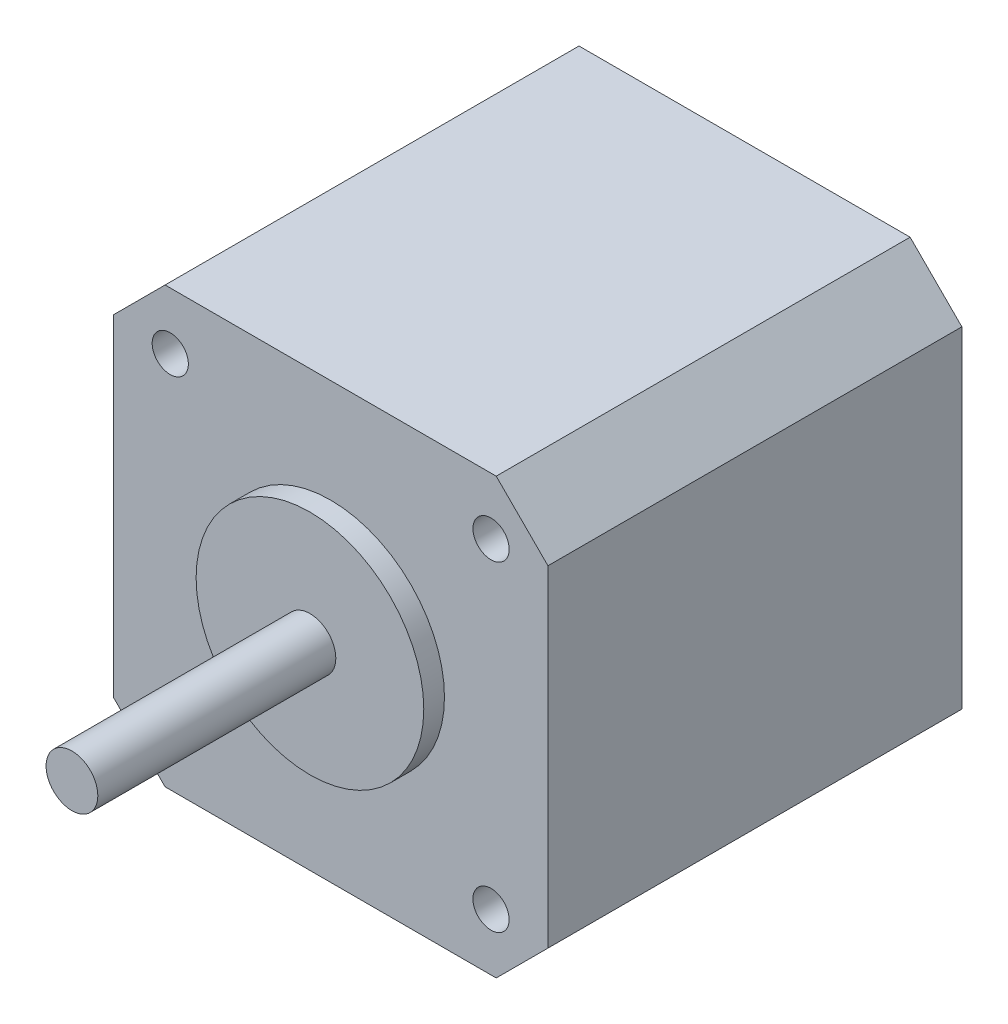
ISO-10303-21;
HEADER;
FILE_DESCRIPTION(('STEP AP214'),'2;1');
FILE_NAME('part.step','',(''),(''),'','','');
FILE_SCHEMA(('AUTOMOTIVE_DESIGN { 1 0 10303 214 1 1 1 1 }'));
ENDSEC;
DATA;
#1=APPLICATION_CONTEXT('core data for automotive mechanical design processes');
#2=APPLICATION_PROTOCOL_DEFINITION('international standard','automotive_design',2000,#1);
#3=PRODUCT_CONTEXT('',#1,'mechanical');
#4=PRODUCT('Part','Part','',(#3));
#5=PRODUCT_RELATED_PRODUCT_CATEGORY('part','',(#4));
#6=PRODUCT_DEFINITION_FORMATION('','',#4);
#7=PRODUCT_DEFINITION_CONTEXT('part definition',#1,'design');
#8=PRODUCT_DEFINITION('design','',#6,#7);
#9=PRODUCT_DEFINITION_SHAPE('','',#8);
#10=(LENGTH_UNIT() NAMED_UNIT(*) SI_UNIT(.MILLI.,.METRE.));
#11=(NAMED_UNIT(*) PLANE_ANGLE_UNIT() SI_UNIT($,.RADIAN.));
#12=(NAMED_UNIT(*) SI_UNIT($,.STERADIAN.) SOLID_ANGLE_UNIT());
#13=UNCERTAINTY_MEASURE_WITH_UNIT(LENGTH_MEASURE(1.E-05),#10,'distance_accuracy_value','');
#14=(GEOMETRIC_REPRESENTATION_CONTEXT(3) GLOBAL_UNCERTAINTY_ASSIGNED_CONTEXT((#13)) GLOBAL_UNIT_ASSIGNED_CONTEXT((#10,
#11,#12)) REPRESENTATION_CONTEXT('',''));
#15=CARTESIAN_POINT('',(0.,0.,0.));
#16=DIRECTION('',(0.,0.,1.));
#17=DIRECTION('',(1.,0.,0.));
#18=AXIS2_PLACEMENT_3D('',#15,#16,#17);
#19=CARTESIAN_POINT('',(-21.,21.,40.));
#20=DIRECTION('',(1.,0.,0.));
#21=DIRECTION('',(0.,0.,-1.));
#22=AXIS2_PLACEMENT_3D('',#19,#20,#21);
#23=PLANE('',#22);
#24=DIRECTION('',(0.,-1.,0.));
#25=VECTOR('',#24,1.);
#26=CARTESIAN_POINT('',(-21.,21.,0.));
#27=LINE('',#26,#25);
#28=CARTESIAN_POINT('',(-21.,16.,0.));
#29=VERTEX_POINT('',#28);
#30=CARTESIAN_POINT('',(-21.,-16.,0.));
#31=VERTEX_POINT('',#30);
#32=EDGE_CURVE('E127',#29,#31,#27,.T.);
#33=ORIENTED_EDGE('',*,*,#32,.T.);
#34=DIRECTION('',(0.,0.,1.));
#35=VECTOR('',#34,1.);
#36=CARTESIAN_POINT('',(-21.,-16.,40.));
#37=LINE('',#36,#35);
#38=CARTESIAN_POINT('',(-21.,-16.,40.));
#39=VERTEX_POINT('',#38);
#40=EDGE_CURVE('E105',#31,#39,#37,.T.);
#41=ORIENTED_EDGE('',*,*,#40,.T.);
#42=DIRECTION('',(0.,-1.,0.));
#43=VECTOR('',#42,1.);
#44=CARTESIAN_POINT('',(-21.,21.,40.));
#45=LINE('',#44,#43);
#46=CARTESIAN_POINT('',(-21.,16.,40.));
#47=VERTEX_POINT('',#46);
#48=EDGE_CURVE('E137',#47,#39,#45,.T.);
#49=ORIENTED_EDGE('',*,*,#48,.F.);
#50=DIRECTION('',(0.,0.,-1.));
#51=VECTOR('',#50,1.);
#52=CARTESIAN_POINT('',(-21.,16.,40.));
#53=LINE('',#52,#51);
#54=EDGE_CURVE('E110',#47,#29,#53,.T.);
#55=ORIENTED_EDGE('',*,*,#54,.T.);
#56=EDGE_LOOP('',(#33,#41,#49,#55));
#57=FACE_BOUND('',#56,.T.);
#58=ADVANCED_FACE('F34',(#57),#23,.F.);
#59=CARTESIAN_POINT('',(-21.,-21.,40.));
#60=DIRECTION('',(0.,1.,0.));
#61=DIRECTION('',(0.,0.,1.));
#62=AXIS2_PLACEMENT_3D('',#59,#60,#61);
#63=PLANE('',#62);
#64=DIRECTION('',(1.,0.,0.));
#65=VECTOR('',#64,1.);
#66=CARTESIAN_POINT('',(-21.,-21.,40.));
#67=LINE('',#66,#65);
#68=CARTESIAN_POINT('',(-16.,-21.,40.));
#69=VERTEX_POINT('',#68);
#70=CARTESIAN_POINT('',(16.,-21.,40.));
#71=VERTEX_POINT('',#70);
#72=EDGE_CURVE('E120',#69,#71,#67,.T.);
#73=ORIENTED_EDGE('',*,*,#72,.F.);
#74=DIRECTION('',(0.,0.,-1.));
#75=VECTOR('',#74,1.);
#76=CARTESIAN_POINT('',(-16.,-21.,40.));
#77=LINE('',#76,#75);
#78=CARTESIAN_POINT('',(-16.,-21.,0.));
#79=VERTEX_POINT('',#78);
#80=EDGE_CURVE('E104',#69,#79,#77,.T.);
#81=ORIENTED_EDGE('',*,*,#80,.T.);
#82=DIRECTION('',(1.,0.,0.));
#83=VECTOR('',#82,1.);
#84=CARTESIAN_POINT('',(-21.,-21.,0.));
#85=LINE('',#84,#83);
#86=CARTESIAN_POINT('',(16.,-21.,0.));
#87=VERTEX_POINT('',#86);
#88=EDGE_CURVE('E117',#79,#87,#85,.T.);
#89=ORIENTED_EDGE('',*,*,#88,.T.);
#90=DIRECTION('',(0.,0.,1.));
#91=VECTOR('',#90,1.);
#92=CARTESIAN_POINT('',(16.,-21.,40.));
#93=LINE('',#92,#91);
#94=EDGE_CURVE('E122',#87,#71,#93,.T.);
#95=ORIENTED_EDGE('',*,*,#94,.T.);
#96=EDGE_LOOP('',(#73,#81,#89,#95));
#97=FACE_BOUND('',#96,.T.);
#98=ADVANCED_FACE('F116',(#97),#63,.F.);
#99=CARTESIAN_POINT('',(21.,21.,40.));
#100=DIRECTION('',(-1.,0.,0.));
#101=DIRECTION('',(0.,0.,1.));
#102=AXIS2_PLACEMENT_3D('',#99,#100,#101);
#103=PLANE('',#102);
#104=DIRECTION('',(0.,1.,0.));
#105=VECTOR('',#104,1.);
#106=CARTESIAN_POINT('',(21.,21.,40.));
#107=LINE('',#106,#105);
#108=CARTESIAN_POINT('',(21.,-16.,40.));
#109=VERTEX_POINT('',#108);
#110=CARTESIAN_POINT('',(21.,16.,40.));
#111=VERTEX_POINT('',#110);
#112=EDGE_CURVE('E163',#109,#111,#107,.T.);
#113=ORIENTED_EDGE('',*,*,#112,.F.);
#114=DIRECTION('',(0.,0.,-1.));
#115=VECTOR('',#114,1.);
#116=CARTESIAN_POINT('',(21.,-16.,40.));
#117=LINE('',#116,#115);
#118=CARTESIAN_POINT('',(21.,-16.,0.));
#119=VERTEX_POINT('',#118);
#120=EDGE_CURVE('E156',#109,#119,#117,.T.);
#121=ORIENTED_EDGE('',*,*,#120,.T.);
#122=DIRECTION('',(0.,1.,0.));
#123=VECTOR('',#122,1.);
#124=CARTESIAN_POINT('',(21.,21.,0.));
#125=LINE('',#124,#123);
#126=CARTESIAN_POINT('',(21.,16.,0.));
#127=VERTEX_POINT('',#126);
#128=EDGE_CURVE('E126',#119,#127,#125,.T.);
#129=ORIENTED_EDGE('',*,*,#128,.T.);
#130=DIRECTION('',(0.,0.,1.));
#131=VECTOR('',#130,1.);
#132=CARTESIAN_POINT('',(21.,16.,40.));
#133=LINE('',#132,#131);
#134=EDGE_CURVE('E154',#127,#111,#133,.T.);
#135=ORIENTED_EDGE('',*,*,#134,.T.);
#136=EDGE_LOOP('',(#113,#121,#129,#135));
#137=FACE_BOUND('',#136,.T.);
#138=ADVANCED_FACE('F161',(#137),#103,.F.);
#139=CARTESIAN_POINT('',(-21.,21.,40.));
#140=DIRECTION('',(0.,-1.,0.));
#141=DIRECTION('',(0.,0.,-1.));
#142=AXIS2_PLACEMENT_3D('',#139,#140,#141);
#143=PLANE('',#142);
#144=DIRECTION('',(-1.,0.,0.));
#145=VECTOR('',#144,1.);
#146=CARTESIAN_POINT('',(-21.,21.,40.));
#147=LINE('',#146,#145);
#148=CARTESIAN_POINT('',(16.,21.,40.));
#149=VERTEX_POINT('',#148);
#150=CARTESIAN_POINT('',(-16.,21.,40.));
#151=VERTEX_POINT('',#150);
#152=EDGE_CURVE('E138',#149,#151,#147,.T.);
#153=ORIENTED_EDGE('',*,*,#152,.F.);
#154=DIRECTION('',(0.,0.,-1.));
#155=VECTOR('',#154,1.);
#156=CARTESIAN_POINT('',(16.,21.,40.));
#157=LINE('',#156,#155);
#158=CARTESIAN_POINT('',(16.,21.,0.));
#159=VERTEX_POINT('',#158);
#160=EDGE_CURVE('E11',#149,#159,#157,.T.);
#161=ORIENTED_EDGE('',*,*,#160,.T.);
#162=DIRECTION('',(-1.,0.,0.));
#163=VECTOR('',#162,1.);
#164=CARTESIAN_POINT('',(-21.,21.,0.));
#165=LINE('',#164,#163);
#166=CARTESIAN_POINT('',(-16.,21.,0.));
#167=VERTEX_POINT('',#166);
#168=EDGE_CURVE('E130',#159,#167,#165,.T.);
#169=ORIENTED_EDGE('',*,*,#168,.T.);
#170=DIRECTION('',(0.,0.,1.));
#171=VECTOR('',#170,1.);
#172=CARTESIAN_POINT('',(-16.,21.,40.));
#173=LINE('',#172,#171);
#174=EDGE_CURVE('E42',#167,#151,#173,.T.);
#175=ORIENTED_EDGE('',*,*,#174,.T.);
#176=EDGE_LOOP('',(#153,#161,#169,#175));
#177=FACE_BOUND('',#176,.T.);
#178=ADVANCED_FACE('F170',(#177),#143,.F.);
#179=CARTESIAN_POINT('',(0.,0.,40.));
#180=DIRECTION('',(0.,0.,1.));
#181=DIRECTION('',(1.,0.,0.));
#182=AXIS2_PLACEMENT_3D('',#179,#180,#181);
#183=PLANE('',#182);
#184=CARTESIAN_POINT('',(-15.5,-15.5,40.));
#185=DIRECTION('',(0.,0.,1.));
#186=DIRECTION('',(-1.,0.,0.));
#187=AXIS2_PLACEMENT_3D('',#184,#185,#186);
#188=CIRCLE('',#187,1.75);
#189=CARTESIAN_POINT('',(-17.25,-15.5,40.));
#190=VERTEX_POINT('',#189);
#191=EDGE_CURVE('E207',#190,#190,#188,.T.);
#192=ORIENTED_EDGE('',*,*,#191,.F.);
#193=EDGE_LOOP('',(#192));
#194=FACE_BOUND('',#193,.T.);
#195=CARTESIAN_POINT('',(15.5,-15.5,40.));
#196=DIRECTION('',(0.,0.,1.));
#197=DIRECTION('',(1.,0.,0.));
#198=AXIS2_PLACEMENT_3D('',#195,#196,#197);
#199=CIRCLE('',#198,1.75);
#200=CARTESIAN_POINT('',(17.25,-15.5,40.));
#201=VERTEX_POINT('',#200);
#202=EDGE_CURVE('E201',#201,#201,#199,.T.);
#203=ORIENTED_EDGE('',*,*,#202,.F.);
#204=EDGE_LOOP('',(#203));
#205=FACE_BOUND('',#204,.T.);
#206=CARTESIAN_POINT('',(15.5,15.5,40.));
#207=DIRECTION('',(0.,0.,1.));
#208=DIRECTION('',(-1.,0.,0.));
#209=AXIS2_PLACEMENT_3D('',#206,#207,#208);
#210=CIRCLE('',#209,1.75);
#211=CARTESIAN_POINT('',(13.75,15.5,40.));
#212=VERTEX_POINT('',#211);
#213=EDGE_CURVE('E195',#212,#212,#210,.T.);
#214=ORIENTED_EDGE('',*,*,#213,.F.);
#215=EDGE_LOOP('',(#214));
#216=FACE_BOUND('',#215,.T.);
#217=CARTESIAN_POINT('',(-15.5,15.5,40.));
#218=DIRECTION('',(0.,0.,1.));
#219=DIRECTION('',(1.,0.,0.));
#220=AXIS2_PLACEMENT_3D('',#217,#218,#219);
#221=CIRCLE('',#220,1.75);
#222=CARTESIAN_POINT('',(-13.75,15.5,40.));
#223=VERTEX_POINT('',#222);
#224=EDGE_CURVE('E189',#223,#223,#221,.T.);
#225=ORIENTED_EDGE('',*,*,#224,.F.);
#226=EDGE_LOOP('',(#225));
#227=FACE_BOUND('',#226,.T.);
#228=CARTESIAN_POINT('',(0.,0.,40.));
#229=DIRECTION('',(0.,0.,1.));
#230=DIRECTION('',(1.,0.,0.));
#231=AXIS2_PLACEMENT_3D('',#228,#229,#230);
#232=CIRCLE('',#231,11.);
#233=CARTESIAN_POINT('',(11.,0.,40.));
#234=VERTEX_POINT('',#233);
#235=EDGE_CURVE('E177',#234,#234,#232,.T.);
#236=ORIENTED_EDGE('',*,*,#235,.F.);
#237=EDGE_LOOP('',(#236));
#238=FACE_BOUND('',#237,.T.);
#239=ORIENTED_EDGE('',*,*,#48,.T.);
#240=DIRECTION('',(-0.707106781186547,0.707106781186549,0.));
#241=VECTOR('',#240,1.);
#242=CARTESIAN_POINT('',(-18.5,-18.5,40.));
#243=LINE('',#242,#241);
#244=EDGE_CURVE('E152',#39,#69,#243,.F.);
#245=ORIENTED_EDGE('',*,*,#244,.T.);
#246=ORIENTED_EDGE('',*,*,#72,.T.);
#247=DIRECTION('',(-0.707106781186549,-0.707106781186547,0.));
#248=VECTOR('',#247,1.);
#249=CARTESIAN_POINT('',(18.5,-18.5,40.));
#250=LINE('',#249,#248);
#251=EDGE_CURVE('E150',#71,#109,#250,.F.);
#252=ORIENTED_EDGE('',*,*,#251,.T.);
#253=ORIENTED_EDGE('',*,*,#112,.T.);
#254=DIRECTION('',(0.707106781186547,-0.707106781186549,0.));
#255=VECTOR('',#254,1.);
#256=CARTESIAN_POINT('',(18.5,18.5,40.));
#257=LINE('',#256,#255);
#258=EDGE_CURVE('E55',#111,#149,#257,.F.);
#259=ORIENTED_EDGE('',*,*,#258,.T.);
#260=ORIENTED_EDGE('',*,*,#152,.T.);
#261=DIRECTION('',(0.707106781186549,0.707106781186547,0.));
#262=VECTOR('',#261,1.);
#263=CARTESIAN_POINT('',(-18.5,18.5,40.));
#264=LINE('',#263,#262);
#265=EDGE_CURVE('E147',#151,#47,#264,.F.);
#266=ORIENTED_EDGE('',*,*,#265,.T.);
#267=EDGE_LOOP('',(#239,#245,#246,#252,#253,#259,#260,#266));
#268=FACE_BOUND('',#267,.T.);
#269=ADVANCED_FACE('F222',(#194,#205,#216,#227,#238,#268),#183,.T.);
#270=CARTESIAN_POINT('',(0.,0.,0.));
#271=DIRECTION('',(0.,0.,1.));
#272=DIRECTION('',(1.,0.,0.));
#273=AXIS2_PLACEMENT_3D('',#270,#271,#272);
#274=PLANE('',#273);
#275=ORIENTED_EDGE('',*,*,#88,.F.);
#276=DIRECTION('',(0.707106781186547,-0.707106781186549,0.));
#277=VECTOR('',#276,1.);
#278=CARTESIAN_POINT('',(-16.,-21.,0.));
#279=LINE('',#278,#277);
#280=EDGE_CURVE('E100',#79,#31,#279,.F.);
#281=ORIENTED_EDGE('',*,*,#280,.T.);
#282=ORIENTED_EDGE('',*,*,#32,.F.);
#283=DIRECTION('',(-0.707106781186549,-0.707106781186547,0.));
#284=VECTOR('',#283,1.);
#285=CARTESIAN_POINT('',(-21.,16.,0.));
#286=LINE('',#285,#284);
#287=EDGE_CURVE('E121',#29,#167,#286,.F.);
#288=ORIENTED_EDGE('',*,*,#287,.T.);
#289=ORIENTED_EDGE('',*,*,#168,.F.);
#290=DIRECTION('',(-0.707106781186547,0.707106781186549,0.));
#291=VECTOR('',#290,1.);
#292=CARTESIAN_POINT('',(16.,21.,0.));
#293=LINE('',#292,#291);
#294=EDGE_CURVE('E141',#159,#127,#293,.F.);
#295=ORIENTED_EDGE('',*,*,#294,.T.);
#296=ORIENTED_EDGE('',*,*,#128,.F.);
#297=DIRECTION('',(0.707106781186549,0.707106781186547,0.));
#298=VECTOR('',#297,1.);
#299=CARTESIAN_POINT('',(21.,-16.,0.));
#300=LINE('',#299,#298);
#301=EDGE_CURVE('E111',#119,#87,#300,.F.);
#302=ORIENTED_EDGE('',*,*,#301,.T.);
#303=EDGE_LOOP('',(#275,#281,#282,#288,#289,#295,#296,#302));
#304=FACE_BOUND('',#303,.T.);
#305=ADVANCED_FACE('F124',(#304),#274,.F.);
#306=CARTESIAN_POINT('',(-16.,-21.,40.));
#307=DIRECTION('',(0.707106781186549,0.707106781186547,0.));
#308=DIRECTION('',(0.,0.,-1.));
#309=AXIS2_PLACEMENT_3D('',#306,#307,#308);
#310=PLANE('',#309);
#311=ORIENTED_EDGE('',*,*,#244,.F.);
#312=ORIENTED_EDGE('',*,*,#40,.F.);
#313=ORIENTED_EDGE('',*,*,#280,.F.);
#314=ORIENTED_EDGE('',*,*,#80,.F.);
#315=EDGE_LOOP('',(#311,#312,#313,#314));
#316=FACE_BOUND('',#315,.T.);
#317=ADVANCED_FACE('F103',(#316),#310,.F.);
#318=CARTESIAN_POINT('',(21.,-16.,40.));
#319=DIRECTION('',(-0.707106781186547,0.707106781186549,0.));
#320=DIRECTION('',(0.,0.,-1.));
#321=AXIS2_PLACEMENT_3D('',#318,#319,#320);
#322=PLANE('',#321);
#323=ORIENTED_EDGE('',*,*,#251,.F.);
#324=ORIENTED_EDGE('',*,*,#94,.F.);
#325=ORIENTED_EDGE('',*,*,#301,.F.);
#326=ORIENTED_EDGE('',*,*,#120,.F.);
#327=EDGE_LOOP('',(#323,#324,#325,#326));
#328=FACE_BOUND('',#327,.T.);
#329=ADVANCED_FACE('F246',(#328),#322,.F.);
#330=CARTESIAN_POINT('',(16.,21.,40.));
#331=DIRECTION('',(-0.707106781186549,-0.707106781186547,0.));
#332=DIRECTION('',(0.,0.,-1.));
#333=AXIS2_PLACEMENT_3D('',#330,#331,#332);
#334=PLANE('',#333);
#335=ORIENTED_EDGE('',*,*,#258,.F.);
#336=ORIENTED_EDGE('',*,*,#134,.F.);
#337=ORIENTED_EDGE('',*,*,#294,.F.);
#338=ORIENTED_EDGE('',*,*,#160,.F.);
#339=EDGE_LOOP('',(#335,#336,#337,#338));
#340=FACE_BOUND('',#339,.T.);
#341=ADVANCED_FACE('F169',(#340),#334,.F.);
#342=CARTESIAN_POINT('',(-21.,16.,40.));
#343=DIRECTION('',(0.707106781186547,-0.707106781186549,0.));
#344=DIRECTION('',(0.,0.,-1.));
#345=AXIS2_PLACEMENT_3D('',#342,#343,#344);
#346=PLANE('',#345);
#347=ORIENTED_EDGE('',*,*,#265,.F.);
#348=ORIENTED_EDGE('',*,*,#174,.F.);
#349=ORIENTED_EDGE('',*,*,#287,.F.);
#350=ORIENTED_EDGE('',*,*,#54,.F.);
#351=EDGE_LOOP('',(#347,#348,#349,#350));
#352=FACE_BOUND('',#351,.T.);
#353=ADVANCED_FACE('F36',(#352),#346,.F.);
#354=CARTESIAN_POINT('',(0.,0.,42.));
#355=DIRECTION('',(0.,0.,-1.));
#356=DIRECTION('',(-1.,0.,0.));
#357=AXIS2_PLACEMENT_3D('',#354,#355,#356);
#358=CYLINDRICAL_SURFACE('',#357,11.);
#359=CARTESIAN_POINT('',(0.,0.,42.));
#360=DIRECTION('',(0.,0.,1.));
#361=DIRECTION('',(1.,0.,0.));
#362=AXIS2_PLACEMENT_3D('',#359,#360,#361);
#363=CIRCLE('',#362,11.);
#364=CARTESIAN_POINT('',(11.,0.,42.));
#365=VERTEX_POINT('',#364);
#366=EDGE_CURVE('E132',#365,#365,#363,.T.);
#367=ORIENTED_EDGE('',*,*,#366,.F.);
#368=EDGE_LOOP('',(#367));
#369=FACE_BOUND('',#368,.T.);
#370=ORIENTED_EDGE('',*,*,#235,.T.);
#371=EDGE_LOOP('',(#370));
#372=FACE_BOUND('',#371,.T.);
#373=ADVANCED_FACE('F238',(#369,#372),#358,.T.);
#374=CARTESIAN_POINT('',(0.,0.,42.));
#375=DIRECTION('',(0.,0.,1.));
#376=DIRECTION('',(1.,0.,0.));
#377=AXIS2_PLACEMENT_3D('',#374,#375,#376);
#378=PLANE('',#377);
#379=CARTESIAN_POINT('',(0.,0.,42.));
#380=DIRECTION('',(0.,0.,1.));
#381=DIRECTION('',(1.,0.,0.));
#382=AXIS2_PLACEMENT_3D('',#379,#380,#381);
#383=CIRCLE('',#382,2.5);
#384=CARTESIAN_POINT('',(2.5,0.,42.));
#385=VERTEX_POINT('',#384);
#386=EDGE_CURVE('E183',#385,#385,#383,.T.);
#387=ORIENTED_EDGE('',*,*,#386,.F.);
#388=EDGE_LOOP('',(#387));
#389=FACE_BOUND('',#388,.T.);
#390=ORIENTED_EDGE('',*,*,#366,.T.);
#391=EDGE_LOOP('',(#390));
#392=FACE_BOUND('',#391,.T.);
#393=ADVANCED_FACE('F243',(#389,#392),#378,.T.);
#394=CARTESIAN_POINT('',(0.,0.,65.));
#395=DIRECTION('',(0.,0.,-1.));
#396=DIRECTION('',(-1.,0.,0.));
#397=AXIS2_PLACEMENT_3D('',#394,#395,#396);
#398=CYLINDRICAL_SURFACE('',#397,2.5);
#399=CARTESIAN_POINT('',(0.,0.,65.));
#400=DIRECTION('',(0.,0.,1.));
#401=DIRECTION('',(1.,0.,0.));
#402=AXIS2_PLACEMENT_3D('',#399,#400,#401);
#403=CIRCLE('',#402,2.5);
#404=CARTESIAN_POINT('',(2.5,0.,65.));
#405=VERTEX_POINT('',#404);
#406=EDGE_CURVE('E180',#405,#405,#403,.T.);
#407=ORIENTED_EDGE('',*,*,#406,.F.);
#408=EDGE_LOOP('',(#407));
#409=FACE_BOUND('',#408,.T.);
#410=ORIENTED_EDGE('',*,*,#386,.T.);
#411=EDGE_LOOP('',(#410));
#412=FACE_BOUND('',#411,.T.);
#413=ADVANCED_FACE('F286',(#409,#412),#398,.T.);
#414=CARTESIAN_POINT('',(0.,0.,65.));
#415=DIRECTION('',(0.,0.,1.));
#416=DIRECTION('',(1.,0.,0.));
#417=AXIS2_PLACEMENT_3D('',#414,#415,#416);
#418=PLANE('',#417);
#419=ORIENTED_EDGE('',*,*,#406,.T.);
#420=EDGE_LOOP('',(#419));
#421=FACE_BOUND('',#420,.T.);
#422=ADVANCED_FACE('F296',(#421),#418,.T.);
#423=CARTESIAN_POINT('',(-15.5,15.5,37.));
#424=DIRECTION('',(0.,0.,1.));
#425=DIRECTION('',(1.,0.,0.));
#426=AXIS2_PLACEMENT_3D('',#423,#424,#425);
#427=CYLINDRICAL_SURFACE('',#426,1.75);
#428=CARTESIAN_POINT('',(-15.5,15.5,37.));
#429=DIRECTION('',(0.,0.,1.));
#430=DIRECTION('',(1.,0.,0.));
#431=AXIS2_PLACEMENT_3D('',#428,#429,#430);
#432=CIRCLE('',#431,1.75);
#433=CARTESIAN_POINT('',(-13.75,15.5,37.));
#434=VERTEX_POINT('',#433);
#435=EDGE_CURVE('E186',#434,#434,#432,.T.);
#436=ORIENTED_EDGE('',*,*,#435,.F.);
#437=EDGE_LOOP('',(#436));
#438=FACE_BOUND('',#437,.T.);
#439=ORIENTED_EDGE('',*,*,#224,.T.);
#440=EDGE_LOOP('',(#439));
#441=FACE_BOUND('',#440,.T.);
#442=ADVANCED_FACE('F306',(#438,#441),#427,.F.);
#443=CARTESIAN_POINT('',(-15.5,15.5,37.));
#444=DIRECTION('',(0.,0.,1.));
#445=DIRECTION('',(1.,0.,0.));
#446=AXIS2_PLACEMENT_3D('',#443,#444,#445);
#447=PLANE('',#446);
#448=ORIENTED_EDGE('',*,*,#435,.T.);
#449=EDGE_LOOP('',(#448));
#450=FACE_BOUND('',#449,.T.);
#451=ADVANCED_FACE('F325',(#450),#447,.T.);
#452=CARTESIAN_POINT('',(15.5,15.5,37.));
#453=DIRECTION('',(0.,0.,1.));
#454=DIRECTION('',(1.,0.,0.));
#455=AXIS2_PLACEMENT_3D('',#452,#453,#454);
#456=CYLINDRICAL_SURFACE('',#455,1.75);
#457=CARTESIAN_POINT('',(15.5,15.5,37.));
#458=DIRECTION('',(0.,0.,1.));
#459=DIRECTION('',(-1.,0.,0.));
#460=AXIS2_PLACEMENT_3D('',#457,#458,#459);
#461=CIRCLE('',#460,1.75);
#462=CARTESIAN_POINT('',(13.75,15.5,37.));
#463=VERTEX_POINT('',#462);
#464=EDGE_CURVE('E198',#463,#463,#461,.T.);
#465=ORIENTED_EDGE('',*,*,#464,.F.);
#466=EDGE_LOOP('',(#465));
#467=FACE_BOUND('',#466,.T.);
#468=ORIENTED_EDGE('',*,*,#213,.T.);
#469=EDGE_LOOP('',(#468));
#470=FACE_BOUND('',#469,.T.);
#471=ADVANCED_FACE('F335',(#467,#470),#456,.F.);
#472=CARTESIAN_POINT('',(15.5,15.5,37.));
#473=DIRECTION('',(0.,0.,-1.));
#474=DIRECTION('',(-1.,0.,0.));
#475=AXIS2_PLACEMENT_3D('',#472,#473,#474);
#476=PLANE('',#475);
#477=ORIENTED_EDGE('',*,*,#464,.T.);
#478=EDGE_LOOP('',(#477));
#479=FACE_BOUND('',#478,.T.);
#480=ADVANCED_FACE('F345',(#479),#476,.F.);
#481=CARTESIAN_POINT('',(15.5,-15.5,37.));
#482=DIRECTION('',(0.,0.,1.));
#483=DIRECTION('',(1.,0.,0.));
#484=AXIS2_PLACEMENT_3D('',#481,#482,#483);
#485=CYLINDRICAL_SURFACE('',#484,1.75);
#486=CARTESIAN_POINT('',(15.5,-15.5,37.));
#487=DIRECTION('',(0.,0.,1.));
#488=DIRECTION('',(1.,0.,0.));
#489=AXIS2_PLACEMENT_3D('',#486,#487,#488);
#490=CIRCLE('',#489,1.75);
#491=CARTESIAN_POINT('',(17.25,-15.5,37.));
#492=VERTEX_POINT('',#491);
#493=EDGE_CURVE('E204',#492,#492,#490,.T.);
#494=ORIENTED_EDGE('',*,*,#493,.F.);
#495=EDGE_LOOP('',(#494));
#496=FACE_BOUND('',#495,.T.);
#497=ORIENTED_EDGE('',*,*,#202,.T.);
#498=EDGE_LOOP('',(#497));
#499=FACE_BOUND('',#498,.T.);
#500=ADVANCED_FACE('F355',(#496,#499),#485,.F.);
#501=CARTESIAN_POINT('',(15.5,-15.5,37.));
#502=DIRECTION('',(0.,0.,1.));
#503=DIRECTION('',(1.,0.,0.));
#504=AXIS2_PLACEMENT_3D('',#501,#502,#503);
#505=PLANE('',#504);
#506=ORIENTED_EDGE('',*,*,#493,.T.);
#507=EDGE_LOOP('',(#506));
#508=FACE_BOUND('',#507,.T.);
#509=ADVANCED_FACE('F218',(#508),#505,.T.);
#510=CARTESIAN_POINT('',(-15.5,-15.5,37.));
#511=DIRECTION('',(0.,0.,1.));
#512=DIRECTION('',(1.,0.,0.));
#513=AXIS2_PLACEMENT_3D('',#510,#511,#512);
#514=CYLINDRICAL_SURFACE('',#513,1.75);
#515=CARTESIAN_POINT('',(-15.5,-15.5,37.));
#516=DIRECTION('',(0.,0.,1.));
#517=DIRECTION('',(-1.,0.,0.));
#518=AXIS2_PLACEMENT_3D('',#515,#516,#517);
#519=CIRCLE('',#518,1.75);
#520=CARTESIAN_POINT('',(-17.25,-15.5,37.));
#521=VERTEX_POINT('',#520);
#522=EDGE_CURVE('E192',#521,#521,#519,.T.);
#523=ORIENTED_EDGE('',*,*,#522,.F.);
#524=EDGE_LOOP('',(#523));
#525=FACE_BOUND('',#524,.T.);
#526=ORIENTED_EDGE('',*,*,#191,.T.);
#527=EDGE_LOOP('',(#526));
#528=FACE_BOUND('',#527,.T.);
#529=ADVANCED_FACE('F215',(#525,#528),#514,.F.);
#530=CARTESIAN_POINT('',(-15.5,-15.5,37.));
#531=DIRECTION('',(0.,0.,-1.));
#532=DIRECTION('',(-1.,0.,0.));
#533=AXIS2_PLACEMENT_3D('',#530,#531,#532);
#534=PLANE('',#533);
#535=ORIENTED_EDGE('',*,*,#522,.T.);
#536=EDGE_LOOP('',(#535));
#537=FACE_BOUND('',#536,.T.);
#538=ADVANCED_FACE('F213',(#537),#534,.F.);
#539=CLOSED_SHELL('',(#58,#98,#138,#178,#269,#305,#317,#329,#341,#353,#373,#393,#413,#422,#442,
#451,#471,#480,#500,#509,#529,#538));
#540=MANIFOLD_SOLID_BREP('B2',#539);
#541=ADVANCED_BREP_SHAPE_REPRESENTATION('',(#18,#540),#14);
#542=SHAPE_DEFINITION_REPRESENTATION(#9,#541);
ENDSEC;
END-ISO-10303-21;
